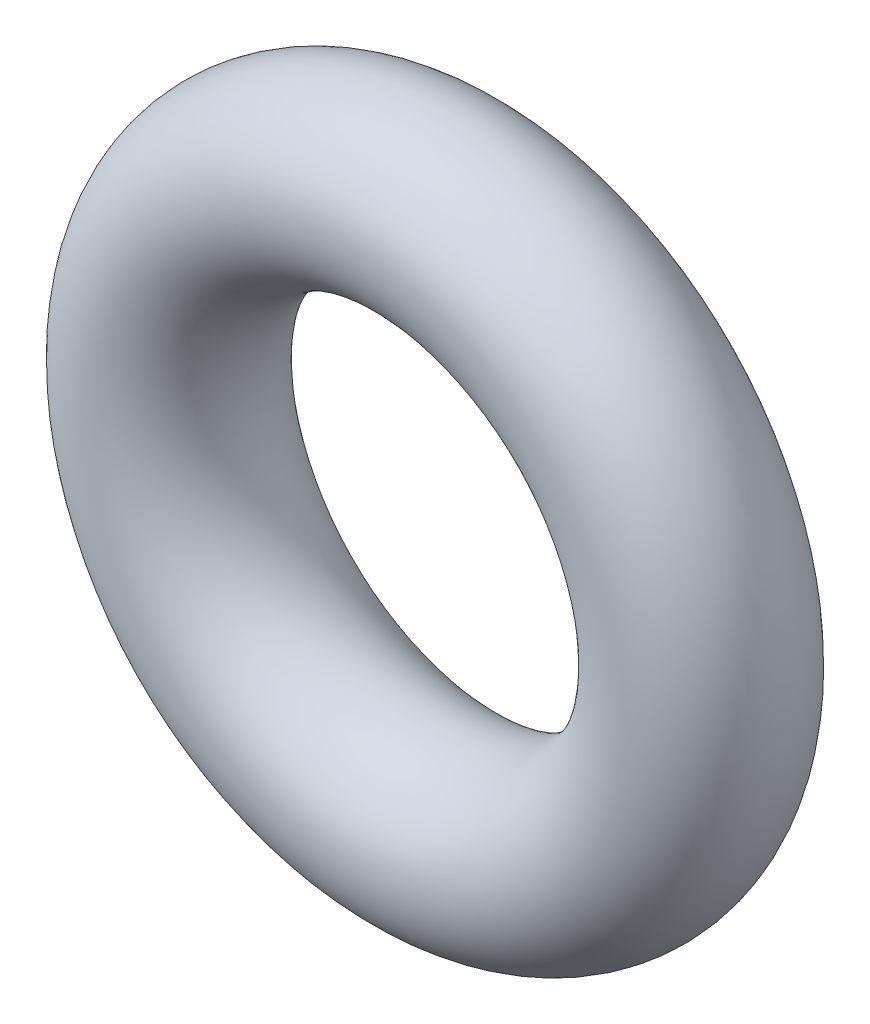
ISO-10303-21;
HEADER;
FILE_DESCRIPTION(('STEP AP214'),'2;1');
FILE_NAME('part.step','',(''),(''),'','','');
FILE_SCHEMA(('AUTOMOTIVE_DESIGN { 1 0 10303 214 1 1 1 1 }'));
ENDSEC;
DATA;
#1=APPLICATION_CONTEXT('core data for automotive mechanical design processes');
#2=APPLICATION_PROTOCOL_DEFINITION('international standard','automotive_design',2000,#1);
#3=PRODUCT_CONTEXT('',#1,'mechanical');
#4=PRODUCT('Part','Part','',(#3));
#5=PRODUCT_RELATED_PRODUCT_CATEGORY('part','',(#4));
#6=PRODUCT_DEFINITION_FORMATION('','',#4);
#7=PRODUCT_DEFINITION_CONTEXT('part definition',#1,'design');
#8=PRODUCT_DEFINITION('design','',#6,#7);
#9=PRODUCT_DEFINITION_SHAPE('','',#8);
#10=(LENGTH_UNIT() NAMED_UNIT(*) SI_UNIT(.MILLI.,.METRE.));
#11=(NAMED_UNIT(*) PLANE_ANGLE_UNIT() SI_UNIT($,.RADIAN.));
#12=(NAMED_UNIT(*) SI_UNIT($,.STERADIAN.) SOLID_ANGLE_UNIT());
#13=UNCERTAINTY_MEASURE_WITH_UNIT(LENGTH_MEASURE(1.E-05),#10,'distance_accuracy_value','');
#14=(GEOMETRIC_REPRESENTATION_CONTEXT(3) GLOBAL_UNCERTAINTY_ASSIGNED_CONTEXT((#13)) GLOBAL_UNIT_ASSIGNED_CONTEXT((#10,
#11,#12)) REPRESENTATION_CONTEXT('',''));
#15=CARTESIAN_POINT('',(0.,0.,0.));
#16=DIRECTION('',(0.,0.,1.));
#17=DIRECTION('',(1.,0.,0.));
#18=AXIS2_PLACEMENT_3D('',#15,#16,#17);
#19=CARTESIAN_POINT('',(0.,0.,0.));
#20=DIRECTION('',(0.,0.,1.));
#21=DIRECTION('',(1.,0.,0.));
#22=AXIS2_PLACEMENT_3D('',#19,#20,#21);
#23=TOROIDAL_SURFACE('',#22,2.7305,0.888999999999999);
#24=CARTESIAN_POINT('',(3.6195,0.,0.));
#25=VERTEX_POINT('',#24);
#26=VERTEX_LOOP('',#25);
#27=FACE_BOUND('',#26,.T.);
#28=ADVANCED_FACE('F33',(#27),#23,.T.);
#29=CLOSED_SHELL('',(#28));
#30=MANIFOLD_SOLID_BREP('B2',#29);
#31=ADVANCED_BREP_SHAPE_REPRESENTATION('',(#18,#30),#14);
#32=SHAPE_DEFINITION_REPRESENTATION(#9,#31);
ENDSEC;
END-ISO-10303-21;
